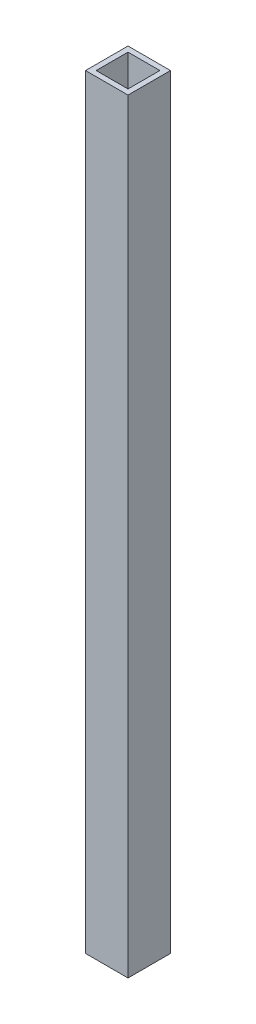
ISO-10303-21;
HEADER;
FILE_DESCRIPTION(('STEP AP214'),'2;1');
FILE_NAME('part.step','',(''),(''),'','','');
FILE_SCHEMA(('AUTOMOTIVE_DESIGN { 1 0 10303 214 1 1 1 1 }'));
ENDSEC;
DATA;
#1=APPLICATION_CONTEXT('core data for automotive mechanical design processes');
#2=APPLICATION_PROTOCOL_DEFINITION('international standard','automotive_design',2000,#1);
#3=PRODUCT_CONTEXT('',#1,'mechanical');
#4=PRODUCT('Part','Part','',(#3));
#5=PRODUCT_RELATED_PRODUCT_CATEGORY('part','',(#4));
#6=PRODUCT_DEFINITION_FORMATION('','',#4);
#7=PRODUCT_DEFINITION_CONTEXT('part definition',#1,'design');
#8=PRODUCT_DEFINITION('design','',#6,#7);
#9=PRODUCT_DEFINITION_SHAPE('','',#8);
#10=(LENGTH_UNIT() NAMED_UNIT(*) SI_UNIT(.MILLI.,.METRE.));
#11=(NAMED_UNIT(*) PLANE_ANGLE_UNIT() SI_UNIT($,.RADIAN.));
#12=(NAMED_UNIT(*) SI_UNIT($,.STERADIAN.) SOLID_ANGLE_UNIT());
#13=UNCERTAINTY_MEASURE_WITH_UNIT(LENGTH_MEASURE(1.E-05),#10,'distance_accuracy_value','');
#14=(GEOMETRIC_REPRESENTATION_CONTEXT(3) GLOBAL_UNCERTAINTY_ASSIGNED_CONTEXT((#13)) GLOBAL_UNIT_ASSIGNED_CONTEXT((#10,
#11,#12)) REPRESENTATION_CONTEXT('',''));
#15=CARTESIAN_POINT('',(0.,0.,0.));
#16=DIRECTION('',(0.,0.,1.));
#17=DIRECTION('',(1.,0.,0.));
#18=AXIS2_PLACEMENT_3D('',#15,#16,#17);
#19=CARTESIAN_POINT('',(0.,457.2,0.));
#20=DIRECTION('',(0.,-1.,0.));
#21=DIRECTION('',(0.,0.,-1.));
#22=AXIS2_PLACEMENT_3D('',#19,#20,#21);
#23=PLANE('',#22);
#24=DIRECTION('',(0.,0.,1.));
#25=VECTOR('',#24,1.);
#26=CARTESIAN_POINT('',(0.,457.2,0.));
#27=LINE('',#26,#25);
#28=CARTESIAN_POINT('',(0.,457.2,-25.4));
#29=VERTEX_POINT('',#28);
#30=CARTESIAN_POINT('',(0.,457.2,0.));
#31=VERTEX_POINT('',#30);
#32=EDGE_CURVE('E134',#29,#31,#27,.T.);
#33=ORIENTED_EDGE('',*,*,#32,.T.);
#34=DIRECTION('',(1.,0.,0.));
#35=VECTOR('',#34,1.);
#36=CARTESIAN_POINT('',(0.,457.2,0.));
#37=LINE('',#36,#35);
#38=CARTESIAN_POINT('',(25.4,457.2,0.));
#39=VERTEX_POINT('',#38);
#40=EDGE_CURVE('E137',#31,#39,#37,.T.);
#41=ORIENTED_EDGE('',*,*,#40,.T.);
#42=DIRECTION('',(0.,0.,-1.));
#43=VECTOR('',#42,1.);
#44=CARTESIAN_POINT('',(25.4,457.2,0.));
#45=LINE('',#44,#43);
#46=CARTESIAN_POINT('',(25.4,457.2,-25.4));
#47=VERTEX_POINT('',#46);
#48=EDGE_CURVE('E140',#39,#47,#45,.T.);
#49=ORIENTED_EDGE('',*,*,#48,.T.);
#50=DIRECTION('',(-1.,0.,0.));
#51=VECTOR('',#50,1.);
#52=CARTESIAN_POINT('',(0.,457.2,-25.4));
#53=LINE('',#52,#51);
#54=EDGE_CURVE('E142',#47,#29,#53,.T.);
#55=ORIENTED_EDGE('',*,*,#54,.T.);
#56=EDGE_LOOP('',(#33,#41,#49,#55));
#57=FACE_BOUND('',#56,.T.);
#58=DIRECTION('',(0.,0.,1.));
#59=VECTOR('',#58,1.);
#60=CARTESIAN_POINT('',(3.175,457.2,-3.175));
#61=LINE('',#60,#59);
#62=CARTESIAN_POINT('',(3.175,457.2,-22.225));
#63=VERTEX_POINT('',#62);
#64=CARTESIAN_POINT('',(3.175,457.2,-3.175));
#65=VERTEX_POINT('',#64);
#66=EDGE_CURVE('E98',#63,#65,#61,.T.);
#67=ORIENTED_EDGE('',*,*,#66,.F.);
#68=DIRECTION('',(-1.,0.,0.));
#69=VECTOR('',#68,1.);
#70=CARTESIAN_POINT('',(3.175,457.2,-22.225));
#71=LINE('',#70,#69);
#72=CARTESIAN_POINT('',(22.225,457.2,-22.225));
#73=VERTEX_POINT('',#72);
#74=EDGE_CURVE('E120',#73,#63,#71,.T.);
#75=ORIENTED_EDGE('',*,*,#74,.F.);
#76=DIRECTION('',(0.,0.,-1.));
#77=VECTOR('',#76,1.);
#78=CARTESIAN_POINT('',(22.225,457.2,-3.175));
#79=LINE('',#78,#77);
#80=CARTESIAN_POINT('',(22.225,457.2,-3.175));
#81=VERTEX_POINT('',#80);
#82=EDGE_CURVE('E118',#81,#73,#79,.T.);
#83=ORIENTED_EDGE('',*,*,#82,.F.);
#84=DIRECTION('',(1.,0.,0.));
#85=VECTOR('',#84,1.);
#86=CARTESIAN_POINT('',(3.175,457.2,-3.175));
#87=LINE('',#86,#85);
#88=EDGE_CURVE('E106',#65,#81,#87,.T.);
#89=ORIENTED_EDGE('',*,*,#88,.F.);
#90=EDGE_LOOP('',(#67,#75,#83,#89));
#91=FACE_BOUND('',#90,.T.);
#92=ADVANCED_FACE('F33',(#57,#91),#23,.F.);
#93=CARTESIAN_POINT('',(0.,0.,0.));
#94=DIRECTION('',(0.,-1.,0.));
#95=DIRECTION('',(0.,0.,-1.));
#96=AXIS2_PLACEMENT_3D('',#93,#94,#95);
#97=PLANE('',#96);
#98=DIRECTION('',(0.,0.,1.));
#99=VECTOR('',#98,1.);
#100=CARTESIAN_POINT('',(0.,0.,0.));
#101=LINE('',#100,#99);
#102=CARTESIAN_POINT('',(0.,0.,-25.4));
#103=VERTEX_POINT('',#102);
#104=CARTESIAN_POINT('',(0.,0.,0.));
#105=VERTEX_POINT('',#104);
#106=EDGE_CURVE('E114',#103,#105,#101,.T.);
#107=ORIENTED_EDGE('',*,*,#106,.F.);
#108=DIRECTION('',(-1.,0.,0.));
#109=VECTOR('',#108,1.);
#110=CARTESIAN_POINT('',(0.,0.,-25.4));
#111=LINE('',#110,#109);
#112=CARTESIAN_POINT('',(25.4,0.,-25.4));
#113=VERTEX_POINT('',#112);
#114=EDGE_CURVE('E138',#113,#103,#111,.T.);
#115=ORIENTED_EDGE('',*,*,#114,.F.);
#116=DIRECTION('',(0.,0.,-1.));
#117=VECTOR('',#116,1.);
#118=CARTESIAN_POINT('',(25.4,0.,0.));
#119=LINE('',#118,#117);
#120=CARTESIAN_POINT('',(25.4,0.,0.));
#121=VERTEX_POINT('',#120);
#122=EDGE_CURVE('E149',#121,#113,#119,.T.);
#123=ORIENTED_EDGE('',*,*,#122,.F.);
#124=DIRECTION('',(1.,0.,0.));
#125=VECTOR('',#124,1.);
#126=CARTESIAN_POINT('',(0.,0.,0.));
#127=LINE('',#126,#125);
#128=EDGE_CURVE('E147',#105,#121,#127,.T.);
#129=ORIENTED_EDGE('',*,*,#128,.F.);
#130=EDGE_LOOP('',(#107,#115,#123,#129));
#131=FACE_BOUND('',#130,.T.);
#132=DIRECTION('',(-1.,0.,0.));
#133=VECTOR('',#132,1.);
#134=CARTESIAN_POINT('',(3.175,0.,-22.225));
#135=LINE('',#134,#133);
#136=CARTESIAN_POINT('',(22.225,0.,-22.225));
#137=VERTEX_POINT('',#136);
#138=CARTESIAN_POINT('',(3.175,0.,-22.225));
#139=VERTEX_POINT('',#138);
#140=EDGE_CURVE('E107',#137,#139,#135,.T.);
#141=ORIENTED_EDGE('',*,*,#140,.T.);
#142=DIRECTION('',(0.,0.,1.));
#143=VECTOR('',#142,1.);
#144=CARTESIAN_POINT('',(3.175,0.,-3.175));
#145=LINE('',#144,#143);
#146=CARTESIAN_POINT('',(3.175,0.,-3.175));
#147=VERTEX_POINT('',#146);
#148=EDGE_CURVE('E56',#139,#147,#145,.T.);
#149=ORIENTED_EDGE('',*,*,#148,.T.);
#150=DIRECTION('',(1.,0.,0.));
#151=VECTOR('',#150,1.);
#152=CARTESIAN_POINT('',(3.175,0.,-3.175));
#153=LINE('',#152,#151);
#154=CARTESIAN_POINT('',(22.225,0.,-3.175));
#155=VERTEX_POINT('',#154);
#156=EDGE_CURVE('E113',#147,#155,#153,.T.);
#157=ORIENTED_EDGE('',*,*,#156,.T.);
#158=DIRECTION('',(0.,0.,-1.));
#159=VECTOR('',#158,1.);
#160=CARTESIAN_POINT('',(22.225,0.,-3.175));
#161=LINE('',#160,#159);
#162=EDGE_CURVE('E126',#155,#137,#161,.T.);
#163=ORIENTED_EDGE('',*,*,#162,.T.);
#164=EDGE_LOOP('',(#141,#149,#157,#163));
#165=FACE_BOUND('',#164,.T.);
#166=ADVANCED_FACE('F167',(#131,#165),#97,.T.);
#167=CARTESIAN_POINT('',(0.,457.2,0.));
#168=DIRECTION('',(1.,0.,0.));
#169=DIRECTION('',(0.,0.,-1.));
#170=AXIS2_PLACEMENT_3D('',#167,#168,#169);
#171=PLANE('',#170);
#172=ORIENTED_EDGE('',*,*,#106,.T.);
#173=DIRECTION('',(0.,-1.,0.));
#174=VECTOR('',#173,1.);
#175=CARTESIAN_POINT('',(0.,457.2,0.));
#176=LINE('',#175,#174);
#177=EDGE_CURVE('E11',#31,#105,#176,.T.);
#178=ORIENTED_EDGE('',*,*,#177,.F.);
#179=ORIENTED_EDGE('',*,*,#32,.F.);
#180=DIRECTION('',(0.,-1.,0.));
#181=VECTOR('',#180,1.);
#182=CARTESIAN_POINT('',(0.,457.2,-25.4));
#183=LINE('',#182,#181);
#184=EDGE_CURVE('E144',#29,#103,#183,.T.);
#185=ORIENTED_EDGE('',*,*,#184,.T.);
#186=EDGE_LOOP('',(#172,#178,#179,#185));
#187=FACE_BOUND('',#186,.T.);
#188=ADVANCED_FACE('F35',(#187),#171,.F.);
#189=CARTESIAN_POINT('',(0.,457.2,0.));
#190=DIRECTION('',(0.,0.,-1.));
#191=DIRECTION('',(-1.,0.,0.));
#192=AXIS2_PLACEMENT_3D('',#189,#190,#191);
#193=PLANE('',#192);
#194=ORIENTED_EDGE('',*,*,#128,.T.);
#195=DIRECTION('',(0.,-1.,0.));
#196=VECTOR('',#195,1.);
#197=CARTESIAN_POINT('',(25.4,457.2,0.));
#198=LINE('',#197,#196);
#199=EDGE_CURVE('E41',#39,#121,#198,.T.);
#200=ORIENTED_EDGE('',*,*,#199,.F.);
#201=ORIENTED_EDGE('',*,*,#40,.F.);
#202=ORIENTED_EDGE('',*,*,#177,.T.);
#203=EDGE_LOOP('',(#194,#200,#201,#202));
#204=FACE_BOUND('',#203,.T.);
#205=ADVANCED_FACE('F177',(#204),#193,.F.);
#206=CARTESIAN_POINT('',(25.4,457.2,0.));
#207=DIRECTION('',(-1.,0.,0.));
#208=DIRECTION('',(0.,0.,1.));
#209=AXIS2_PLACEMENT_3D('',#206,#207,#208);
#210=PLANE('',#209);
#211=ORIENTED_EDGE('',*,*,#122,.T.);
#212=DIRECTION('',(0.,-1.,0.));
#213=VECTOR('',#212,1.);
#214=CARTESIAN_POINT('',(25.4,457.2,-25.4));
#215=LINE('',#214,#213);
#216=EDGE_CURVE('E154',#47,#113,#215,.T.);
#217=ORIENTED_EDGE('',*,*,#216,.F.);
#218=ORIENTED_EDGE('',*,*,#48,.F.);
#219=ORIENTED_EDGE('',*,*,#199,.T.);
#220=EDGE_LOOP('',(#211,#217,#218,#219));
#221=FACE_BOUND('',#220,.T.);
#222=ADVANCED_FACE('F161',(#221),#210,.F.);
#223=CARTESIAN_POINT('',(0.,457.2,-25.4));
#224=DIRECTION('',(0.,0.,1.));
#225=DIRECTION('',(1.,0.,0.));
#226=AXIS2_PLACEMENT_3D('',#223,#224,#225);
#227=PLANE('',#226);
#228=ORIENTED_EDGE('',*,*,#114,.T.);
#229=ORIENTED_EDGE('',*,*,#184,.F.);
#230=ORIENTED_EDGE('',*,*,#54,.F.);
#231=ORIENTED_EDGE('',*,*,#216,.T.);
#232=EDGE_LOOP('',(#228,#229,#230,#231));
#233=FACE_BOUND('',#232,.T.);
#234=ADVANCED_FACE('F171',(#233),#227,.F.);
#235=CARTESIAN_POINT('',(3.175,457.2,-3.175));
#236=DIRECTION('',(1.,0.,0.));
#237=DIRECTION('',(0.,0.,-1.));
#238=AXIS2_PLACEMENT_3D('',#235,#236,#237);
#239=PLANE('',#238);
#240=ORIENTED_EDGE('',*,*,#148,.F.);
#241=DIRECTION('',(0.,-1.,0.));
#242=VECTOR('',#241,1.);
#243=CARTESIAN_POINT('',(3.175,457.2,-22.225));
#244=LINE('',#243,#242);
#245=EDGE_CURVE('E102',#63,#139,#244,.T.);
#246=ORIENTED_EDGE('',*,*,#245,.F.);
#247=ORIENTED_EDGE('',*,*,#66,.T.);
#248=DIRECTION('',(0.,-1.,0.));
#249=VECTOR('',#248,1.);
#250=CARTESIAN_POINT('',(3.175,457.2,-3.175));
#251=LINE('',#250,#249);
#252=EDGE_CURVE('E101',#65,#147,#251,.T.);
#253=ORIENTED_EDGE('',*,*,#252,.T.);
#254=EDGE_LOOP('',(#240,#246,#247,#253));
#255=FACE_BOUND('',#254,.T.);
#256=ADVANCED_FACE('F100',(#255),#239,.T.);
#257=CARTESIAN_POINT('',(3.175,457.2,-3.175));
#258=DIRECTION('',(0.,0.,-1.));
#259=DIRECTION('',(-1.,0.,0.));
#260=AXIS2_PLACEMENT_3D('',#257,#258,#259);
#261=PLANE('',#260);
#262=ORIENTED_EDGE('',*,*,#156,.F.);
#263=ORIENTED_EDGE('',*,*,#252,.F.);
#264=ORIENTED_EDGE('',*,*,#88,.T.);
#265=DIRECTION('',(0.,-1.,0.));
#266=VECTOR('',#265,1.);
#267=CARTESIAN_POINT('',(22.225,457.2,-3.175));
#268=LINE('',#267,#266);
#269=EDGE_CURVE('E115',#81,#155,#268,.T.);
#270=ORIENTED_EDGE('',*,*,#269,.T.);
#271=EDGE_LOOP('',(#262,#263,#264,#270));
#272=FACE_BOUND('',#271,.T.);
#273=ADVANCED_FACE('F110',(#272),#261,.T.);
#274=CARTESIAN_POINT('',(22.225,457.2,-3.175));
#275=DIRECTION('',(-1.,0.,0.));
#276=DIRECTION('',(0.,0.,1.));
#277=AXIS2_PLACEMENT_3D('',#274,#275,#276);
#278=PLANE('',#277);
#279=ORIENTED_EDGE('',*,*,#162,.F.);
#280=ORIENTED_EDGE('',*,*,#269,.F.);
#281=ORIENTED_EDGE('',*,*,#82,.T.);
#282=DIRECTION('',(0.,-1.,0.));
#283=VECTOR('',#282,1.);
#284=CARTESIAN_POINT('',(22.225,457.2,-22.225));
#285=LINE('',#284,#283);
#286=EDGE_CURVE('E48',#73,#137,#285,.T.);
#287=ORIENTED_EDGE('',*,*,#286,.T.);
#288=EDGE_LOOP('',(#279,#280,#281,#287));
#289=FACE_BOUND('',#288,.T.);
#290=ADVANCED_FACE('F200',(#289),#278,.T.);
#291=CARTESIAN_POINT('',(3.175,457.2,-22.225));
#292=DIRECTION('',(0.,0.,1.));
#293=DIRECTION('',(1.,0.,0.));
#294=AXIS2_PLACEMENT_3D('',#291,#292,#293);
#295=PLANE('',#294);
#296=ORIENTED_EDGE('',*,*,#140,.F.);
#297=ORIENTED_EDGE('',*,*,#286,.F.);
#298=ORIENTED_EDGE('',*,*,#74,.T.);
#299=ORIENTED_EDGE('',*,*,#245,.T.);
#300=EDGE_LOOP('',(#296,#297,#298,#299));
#301=FACE_BOUND('',#300,.T.);
#302=ADVANCED_FACE('F204',(#301),#295,.T.);
#303=CLOSED_SHELL('',(#92,#166,#188,#205,#222,#234,#256,#273,#290,#302));
#304=MANIFOLD_SOLID_BREP('B2',#303);
#305=ADVANCED_BREP_SHAPE_REPRESENTATION('',(#18,#304),#14);
#306=SHAPE_DEFINITION_REPRESENTATION(#9,#305);
ENDSEC;
END-ISO-10303-21;
